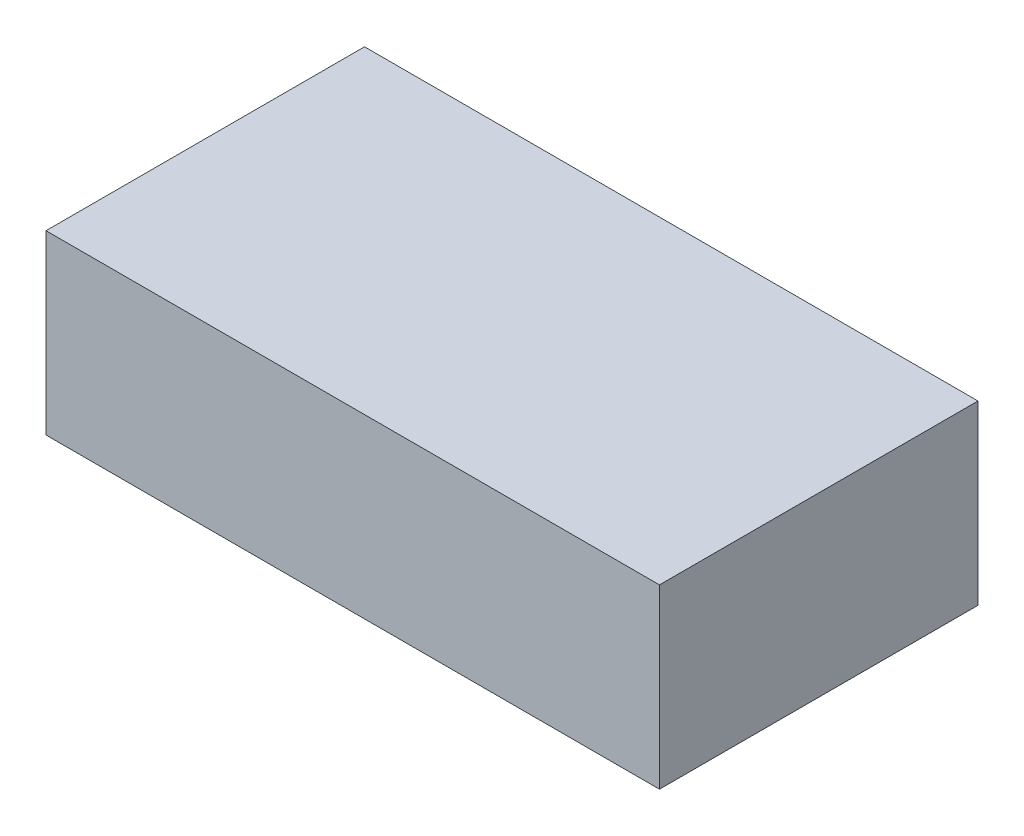
ISO-10303-21;
HEADER;
FILE_DESCRIPTION(('STEP AP214'),'2;1');
FILE_NAME('part.step','',(''),(''),'','','');
FILE_SCHEMA(('AUTOMOTIVE_DESIGN { 1 0 10303 214 1 1 1 1 }'));
ENDSEC;
DATA;
#1=APPLICATION_CONTEXT('core data for automotive mechanical design processes');
#2=APPLICATION_PROTOCOL_DEFINITION('international standard','automotive_design',2000,#1);
#3=PRODUCT_CONTEXT('',#1,'mechanical');
#4=PRODUCT('Part','Part','',(#3));
#5=PRODUCT_RELATED_PRODUCT_CATEGORY('part','',(#4));
#6=PRODUCT_DEFINITION_FORMATION('','',#4);
#7=PRODUCT_DEFINITION_CONTEXT('part definition',#1,'design');
#8=PRODUCT_DEFINITION('design','',#6,#7);
#9=PRODUCT_DEFINITION_SHAPE('','',#8);
#10=(LENGTH_UNIT() NAMED_UNIT(*) SI_UNIT(.MILLI.,.METRE.));
#11=(NAMED_UNIT(*) PLANE_ANGLE_UNIT() SI_UNIT($,.RADIAN.));
#12=(NAMED_UNIT(*) SI_UNIT($,.STERADIAN.) SOLID_ANGLE_UNIT());
#13=UNCERTAINTY_MEASURE_WITH_UNIT(LENGTH_MEASURE(1.E-05),#10,'distance_accuracy_value','');
#14=(GEOMETRIC_REPRESENTATION_CONTEXT(3) GLOBAL_UNCERTAINTY_ASSIGNED_CONTEXT((#13)) GLOBAL_UNIT_ASSIGNED_CONTEXT((#10,
#11,#12)) REPRESENTATION_CONTEXT('',''));
#15=CARTESIAN_POINT('',(0.,0.,0.));
#16=DIRECTION('',(0.,0.,1.));
#17=DIRECTION('',(1.,0.,0.));
#18=AXIS2_PLACEMENT_3D('',#15,#16,#17);
#19=CARTESIAN_POINT('',(0.,15.,0.));
#20=DIRECTION('',(1.,0.,0.));
#21=DIRECTION('',(0.,0.,-1.));
#22=AXIS2_PLACEMENT_3D('',#19,#20,#21);
#23=PLANE('',#22);
#24=DIRECTION('',(0.,0.,1.));
#25=VECTOR('',#24,1.);
#26=CARTESIAN_POINT('',(0.,0.,0.));
#27=LINE('',#26,#25);
#28=CARTESIAN_POINT('',(0.,0.,0.));
#29=VERTEX_POINT('',#28);
#30=CARTESIAN_POINT('',(0.,0.,27.));
#31=VERTEX_POINT('',#30);
#32=EDGE_CURVE('E98',#29,#31,#27,.T.);
#33=ORIENTED_EDGE('',*,*,#32,.T.);
#34=DIRECTION('',(0.,-1.,0.));
#35=VECTOR('',#34,1.);
#36=CARTESIAN_POINT('',(0.,15.,27.));
#37=LINE('',#36,#35);
#38=CARTESIAN_POINT('',(0.,15.,27.));
#39=VERTEX_POINT('',#38);
#40=EDGE_CURVE('E11',#39,#31,#37,.T.);
#41=ORIENTED_EDGE('',*,*,#40,.F.);
#42=DIRECTION('',(0.,0.,1.));
#43=VECTOR('',#42,1.);
#44=CARTESIAN_POINT('',(0.,15.,0.));
#45=LINE('',#44,#43);
#46=CARTESIAN_POINT('',(0.,15.,0.));
#47=VERTEX_POINT('',#46);
#48=EDGE_CURVE('E86',#47,#39,#45,.T.);
#49=ORIENTED_EDGE('',*,*,#48,.F.);
#50=DIRECTION('',(0.,-1.,0.));
#51=VECTOR('',#50,1.);
#52=CARTESIAN_POINT('',(0.,15.,0.));
#53=LINE('',#52,#51);
#54=EDGE_CURVE('E94',#47,#29,#53,.T.);
#55=ORIENTED_EDGE('',*,*,#54,.T.);
#56=EDGE_LOOP('',(#33,#41,#49,#55));
#57=FACE_BOUND('',#56,.T.);
#58=ADVANCED_FACE('F35',(#57),#23,.F.);
#59=CARTESIAN_POINT('',(0.,15.,27.));
#60=DIRECTION('',(0.,0.,-1.));
#61=DIRECTION('',(-1.,0.,0.));
#62=AXIS2_PLACEMENT_3D('',#59,#60,#61);
#63=PLANE('',#62);
#64=DIRECTION('',(1.,0.,0.));
#65=VECTOR('',#64,1.);
#66=CARTESIAN_POINT('',(0.,0.,27.));
#67=LINE('',#66,#65);
#68=CARTESIAN_POINT('',(52.,0.,27.));
#69=VERTEX_POINT('',#68);
#70=EDGE_CURVE('E90',#31,#69,#67,.T.);
#71=ORIENTED_EDGE('',*,*,#70,.T.);
#72=DIRECTION('',(0.,-1.,0.));
#73=VECTOR('',#72,1.);
#74=CARTESIAN_POINT('',(52.,15.,27.));
#75=LINE('',#74,#73);
#76=CARTESIAN_POINT('',(52.,15.,27.));
#77=VERTEX_POINT('',#76);
#78=EDGE_CURVE('E43',#77,#69,#75,.T.);
#79=ORIENTED_EDGE('',*,*,#78,.F.);
#80=DIRECTION('',(1.,0.,0.));
#81=VECTOR('',#80,1.);
#82=CARTESIAN_POINT('',(0.,15.,27.));
#83=LINE('',#82,#81);
#84=EDGE_CURVE('E81',#39,#77,#83,.T.);
#85=ORIENTED_EDGE('',*,*,#84,.F.);
#86=ORIENTED_EDGE('',*,*,#40,.T.);
#87=EDGE_LOOP('',(#71,#79,#85,#86));
#88=FACE_BOUND('',#87,.T.);
#89=ADVANCED_FACE('F89',(#88),#63,.F.);
#90=CARTESIAN_POINT('',(52.,15.,0.));
#91=DIRECTION('',(-1.,0.,0.));
#92=DIRECTION('',(0.,0.,1.));
#93=AXIS2_PLACEMENT_3D('',#90,#91,#92);
#94=PLANE('',#93);
#95=DIRECTION('',(0.,0.,-1.));
#96=VECTOR('',#95,1.);
#97=CARTESIAN_POINT('',(52.,0.,0.));
#98=LINE('',#97,#96);
#99=CARTESIAN_POINT('',(52.,0.,0.));
#100=VERTEX_POINT('',#99);
#101=EDGE_CURVE('E68',#69,#100,#98,.T.);
#102=ORIENTED_EDGE('',*,*,#101,.T.);
#103=DIRECTION('',(0.,-1.,0.));
#104=VECTOR('',#103,1.);
#105=CARTESIAN_POINT('',(52.,15.,0.));
#106=LINE('',#105,#104);
#107=CARTESIAN_POINT('',(52.,15.,0.));
#108=VERTEX_POINT('',#107);
#109=EDGE_CURVE('E91',#108,#100,#106,.T.);
#110=ORIENTED_EDGE('',*,*,#109,.F.);
#111=DIRECTION('',(0.,0.,-1.));
#112=VECTOR('',#111,1.);
#113=CARTESIAN_POINT('',(52.,15.,0.));
#114=LINE('',#113,#112);
#115=EDGE_CURVE('E84',#77,#108,#114,.T.);
#116=ORIENTED_EDGE('',*,*,#115,.F.);
#117=ORIENTED_EDGE('',*,*,#78,.T.);
#118=EDGE_LOOP('',(#102,#110,#116,#117));
#119=FACE_BOUND('',#118,.T.);
#120=ADVANCED_FACE('F92',(#119),#94,.F.);
#121=CARTESIAN_POINT('',(0.,15.,0.));
#122=DIRECTION('',(0.,0.,1.));
#123=DIRECTION('',(1.,0.,0.));
#124=AXIS2_PLACEMENT_3D('',#121,#122,#123);
#125=PLANE('',#124);
#126=DIRECTION('',(-1.,0.,0.));
#127=VECTOR('',#126,1.);
#128=CARTESIAN_POINT('',(0.,0.,0.));
#129=LINE('',#128,#127);
#130=EDGE_CURVE('E74',#100,#29,#129,.T.);
#131=ORIENTED_EDGE('',*,*,#130,.T.);
#132=ORIENTED_EDGE('',*,*,#54,.F.);
#133=DIRECTION('',(-1.,0.,0.));
#134=VECTOR('',#133,1.);
#135=CARTESIAN_POINT('',(0.,15.,0.));
#136=LINE('',#135,#134);
#137=EDGE_CURVE('E51',#108,#47,#136,.T.);
#138=ORIENTED_EDGE('',*,*,#137,.F.);
#139=ORIENTED_EDGE('',*,*,#109,.T.);
#140=EDGE_LOOP('',(#131,#132,#138,#139));
#141=FACE_BOUND('',#140,.T.);
#142=ADVANCED_FACE('F105',(#141),#125,.F.);
#143=CARTESIAN_POINT('',(0.,15.,0.));
#144=DIRECTION('',(0.,1.,0.));
#145=DIRECTION('',(0.,0.,1.));
#146=AXIS2_PLACEMENT_3D('',#143,#144,#145);
#147=PLANE('',#146);
#148=ORIENTED_EDGE('',*,*,#48,.T.);
#149=ORIENTED_EDGE('',*,*,#84,.T.);
#150=ORIENTED_EDGE('',*,*,#115,.T.);
#151=ORIENTED_EDGE('',*,*,#137,.T.);
#152=EDGE_LOOP('',(#148,#149,#150,#151));
#153=FACE_BOUND('',#152,.T.);
#154=ADVANCED_FACE('F82',(#153),#147,.T.);
#155=CARTESIAN_POINT('',(0.,0.,0.));
#156=DIRECTION('',(0.,1.,0.));
#157=DIRECTION('',(0.,0.,1.));
#158=AXIS2_PLACEMENT_3D('',#155,#156,#157);
#159=PLANE('',#158);
#160=ORIENTED_EDGE('',*,*,#32,.F.);
#161=ORIENTED_EDGE('',*,*,#130,.F.);
#162=ORIENTED_EDGE('',*,*,#101,.F.);
#163=ORIENTED_EDGE('',*,*,#70,.F.);
#164=EDGE_LOOP('',(#160,#161,#162,#163));
#165=FACE_BOUND('',#164,.T.);
#166=ADVANCED_FACE('F108',(#165),#159,.F.);
#167=CLOSED_SHELL('',(#58,#89,#120,#142,#154,#166));
#168=MANIFOLD_SOLID_BREP('B2',#167);
#169=ADVANCED_BREP_SHAPE_REPRESENTATION('',(#18,#168),#14);
#170=SHAPE_DEFINITION_REPRESENTATION(#9,#169);
ENDSEC;
END-ISO-10303-21;
